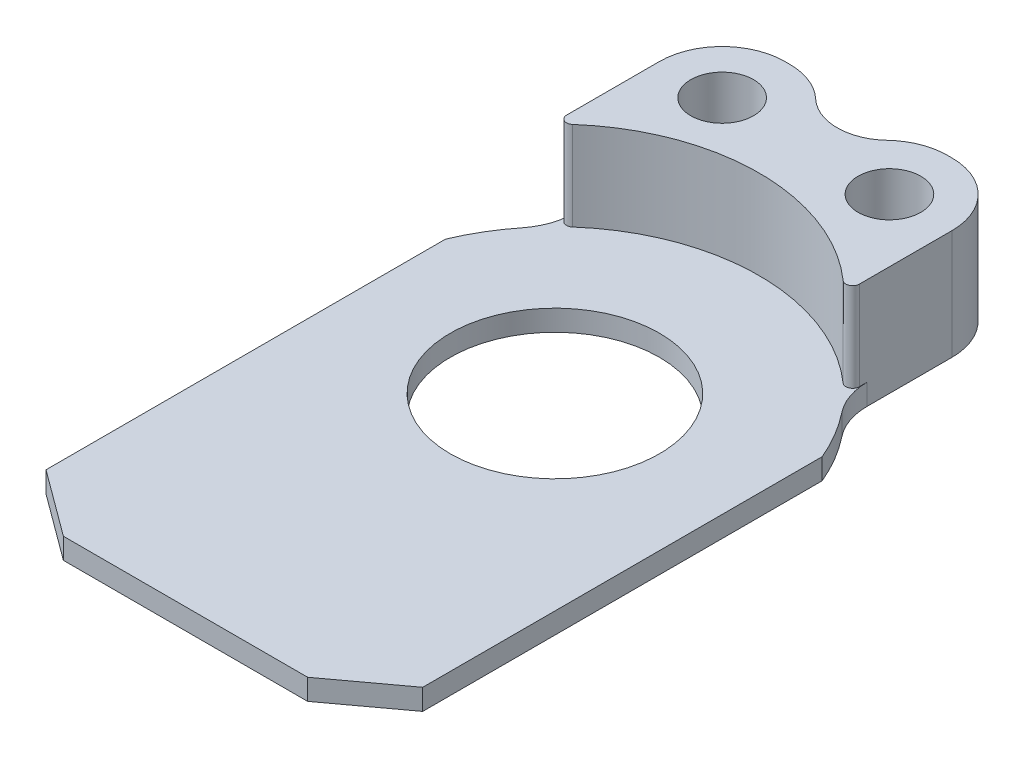
ISO-10303-21;
HEADER;
FILE_DESCRIPTION(('STEP AP214'),'2;1');
FILE_NAME('part.step','',(''),(''),'','','');
FILE_SCHEMA(('AUTOMOTIVE_DESIGN { 1 0 10303 214 1 1 1 1 }'));
ENDSEC;
DATA;
#1=APPLICATION_CONTEXT('core data for automotive mechanical design processes');
#2=APPLICATION_PROTOCOL_DEFINITION('international standard','automotive_design',2000,#1);
#3=PRODUCT_CONTEXT('',#1,'mechanical');
#4=PRODUCT('Part','Part','',(#3));
#5=PRODUCT_RELATED_PRODUCT_CATEGORY('part','',(#4));
#6=PRODUCT_DEFINITION_FORMATION('','',#4);
#7=PRODUCT_DEFINITION_CONTEXT('part definition',#1,'design');
#8=PRODUCT_DEFINITION('design','',#6,#7);
#9=PRODUCT_DEFINITION_SHAPE('','',#8);
#10=(LENGTH_UNIT() NAMED_UNIT(*) SI_UNIT(.MILLI.,.METRE.));
#11=(NAMED_UNIT(*) PLANE_ANGLE_UNIT() SI_UNIT($,.RADIAN.));
#12=(NAMED_UNIT(*) SI_UNIT($,.STERADIAN.) SOLID_ANGLE_UNIT());
#13=UNCERTAINTY_MEASURE_WITH_UNIT(LENGTH_MEASURE(1.E-05),#10,'distance_accuracy_value','');
#14=(GEOMETRIC_REPRESENTATION_CONTEXT(3) GLOBAL_UNCERTAINTY_ASSIGNED_CONTEXT((#13)) GLOBAL_UNIT_ASSIGNED_CONTEXT((#10,
#11,#12)) REPRESENTATION_CONTEXT('',''));
#15=CARTESIAN_POINT('',(0.,0.,0.));
#16=DIRECTION('',(0.,0.,1.));
#17=DIRECTION('',(1.,0.,0.));
#18=AXIS2_PLACEMENT_3D('',#15,#16,#17);
#19=CARTESIAN_POINT('',(0.,8.334375,0.));
#20=DIRECTION('',(0.,-1.,0.));
#21=DIRECTION('',(0.,0.,-1.));
#22=AXIS2_PLACEMENT_3D('',#19,#20,#21);
#23=CYLINDRICAL_SURFACE('',#22,15.505758652836);
#24=DIRECTION('',(0.,1.,0.));
#25=VECTOR('',#24,1.);
#26=CARTESIAN_POINT('',(-10.2680964037683,1.5875,-11.6187240109626));
#27=LINE('',#26,#25);
#28=CARTESIAN_POINT('',(-10.2680964037683,1.5875,-11.6187240109626));
#29=VERTEX_POINT('',#28);
#30=CARTESIAN_POINT('',(-10.2680964037683,8.334375,-11.6187240109626));
#31=VERTEX_POINT('',#30);
#32=EDGE_CURVE('E56',#29,#31,#27,.T.);
#33=ORIENTED_EDGE('',*,*,#32,.F.);
#34=CARTESIAN_POINT('',(0.,1.5875,0.));
#35=DIRECTION('',(0.,1.,0.));
#36=DIRECTION('',(0.,0.,-1.));
#37=AXIS2_PLACEMENT_3D('',#34,#35,#36);
#38=CIRCLE('',#37,15.505758652836);
#39=CARTESIAN_POINT('',(10.2680964037683,1.5875,-11.6187240109626));
#40=VERTEX_POINT('',#39);
#41=EDGE_CURVE('E338',#40,#29,#38,.T.);
#42=ORIENTED_EDGE('',*,*,#41,.F.);
#43=DIRECTION('',(0.,1.,0.));
#44=VECTOR('',#43,1.);
#45=CARTESIAN_POINT('',(10.2680964037683,1.5875,-11.6187240109626));
#46=LINE('',#45,#44);
#47=CARTESIAN_POINT('',(10.2680964037683,8.334375,-11.6187240109626));
#48=VERTEX_POINT('',#47);
#49=EDGE_CURVE('E214',#40,#48,#46,.T.);
#50=ORIENTED_EDGE('',*,*,#49,.T.);
#51=CARTESIAN_POINT('',(0.,8.334375,0.));
#52=DIRECTION('',(0.,-1.,0.));
#53=DIRECTION('',(0.,0.,-1.));
#54=AXIS2_PLACEMENT_3D('',#51,#52,#53);
#55=CIRCLE('',#54,15.505758652836);
#56=EDGE_CURVE('E257',#31,#48,#55,.T.);
#57=ORIENTED_EDGE('',*,*,#56,.F.);
#58=EDGE_LOOP('',(#33,#42,#50,#57));
#59=FACE_BOUND('',#58,.T.);
#60=ADVANCED_FACE('F41',(#59),#23,.F.);
#61=CARTESIAN_POINT('',(0.,1.5875,0.));
#62=DIRECTION('',(0.,-1.,0.));
#63=DIRECTION('',(0.,0.,-1.));
#64=AXIS2_PLACEMENT_3D('',#61,#62,#63);
#65=CYLINDRICAL_SURFACE('',#64,15.505758652836);
#66=DIRECTION('',(0.,-1.,0.));
#67=VECTOR('',#66,1.);
#68=CARTESIAN_POINT('',(12.1447985655802,0.79375,-9.6401462230342));
#69=LINE('',#68,#67);
#70=CARTESIAN_POINT('',(12.1447985655802,1.5875,-9.6401462230342));
#71=VERTEX_POINT('',#70);
#72=CARTESIAN_POINT('',(12.1447985655802,0.,-9.6401462230342));
#73=VERTEX_POINT('',#72);
#74=EDGE_CURVE('E49',#71,#73,#69,.T.);
#75=ORIENTED_EDGE('',*,*,#74,.F.);
#76=CARTESIAN_POINT('',(14.3002,1.5875,-5.9944));
#77=VERTEX_POINT('',#76);
#78=EDGE_CURVE('E335',#77,#71,#38,.T.);
#79=ORIENTED_EDGE('',*,*,#78,.F.);
#80=DIRECTION('',(0.,-1.,0.));
#81=VECTOR('',#80,1.);
#82=CARTESIAN_POINT('',(14.3002,1.5875,-5.9944));
#83=LINE('',#82,#81);
#84=CARTESIAN_POINT('',(14.3002,0.,-5.9944));
#85=VERTEX_POINT('',#84);
#86=EDGE_CURVE('E349',#77,#85,#83,.T.);
#87=ORIENTED_EDGE('',*,*,#86,.T.);
#88=CARTESIAN_POINT('',(0.,0.,0.));
#89=DIRECTION('',(0.,1.,0.));
#90=DIRECTION('',(0.,0.,-1.));
#91=AXIS2_PLACEMENT_3D('',#88,#89,#90);
#92=CIRCLE('',#91,15.505758652836);
#93=EDGE_CURVE('E64',#85,#73,#92,.T.);
#94=ORIENTED_EDGE('',*,*,#93,.T.);
#95=EDGE_LOOP('',(#75,#79,#87,#94));
#96=FACE_BOUND('',#95,.T.);
#97=ADVANCED_FACE('F422',(#96),#65,.T.);
#98=CARTESIAN_POINT('',(0.,1.5875,0.));
#99=DIRECTION('',(0.,-1.,0.));
#100=DIRECTION('',(0.,0.,-1.));
#101=AXIS2_PLACEMENT_3D('',#98,#99,#100);
#102=PLANE('',#101);
#103=CARTESIAN_POINT('',(0.,1.5875,0.));
#104=DIRECTION('',(0.,1.,0.));
#105=DIRECTION('',(0.,0.,1.));
#106=AXIS2_PLACEMENT_3D('',#103,#104,#105);
#107=CIRCLE('',#106,7.93750000000004);
#108=CARTESIAN_POINT('',(0.,1.5875,7.93750000000004));
#109=VERTEX_POINT('',#108);
#110=EDGE_CURVE('E329',#109,#109,#107,.T.);
#111=ORIENTED_EDGE('',*,*,#110,.F.);
#112=EDGE_LOOP('',(#111));
#113=FACE_BOUND('',#112,.T.);
#114=ORIENTED_EDGE('',*,*,#78,.T.);
#115=CARTESIAN_POINT('',(15.875,1.5875,-12.6010588371876));
#116=DIRECTION('',(0.,-1.,0.));
#117=DIRECTION('',(0.,0.,-1.));
#118=AXIS2_PLACEMENT_3D('',#115,#116,#117);
#119=CIRCLE('',#118,4.7625);
#120=CARTESIAN_POINT('',(11.1125,1.5875,-12.6010588371876));
#121=VERTEX_POINT('',#120);
#122=EDGE_CURVE('E201',#121,#71,#119,.F.);
#123=ORIENTED_EDGE('',*,*,#122,.F.);
#124=DIRECTION('',(0.,0.,1.));
#125=VECTOR('',#124,1.);
#126=CARTESIAN_POINT('',(11.1125,1.5875,-19.05));
#127=LINE('',#126,#125);
#128=CARTESIAN_POINT('',(11.1125,1.5875,-11.9993768980427));
#129=VERTEX_POINT('',#128);
#130=EDGE_CURVE('E193',#121,#129,#127,.T.);
#131=ORIENTED_EDGE('',*,*,#130,.T.);
#132=CARTESIAN_POINT('',(10.6045,1.5875,-11.9993768980427));
#133=DIRECTION('',(0.,-1.,0.));
#134=DIRECTION('',(0.,0.,-1.));
#135=AXIS2_PLACEMENT_3D('',#132,#133,#134);
#136=CIRCLE('',#135,0.507999999999999);
#137=EDGE_CURVE('E198',#129,#40,#136,.T.);
#138=ORIENTED_EDGE('',*,*,#137,.T.);
#139=ORIENTED_EDGE('',*,*,#41,.T.);
#140=CARTESIAN_POINT('',(-10.6045,1.5875,-11.9993768980427));
#141=DIRECTION('',(0.,-1.,0.));
#142=DIRECTION('',(0.,0.,1.));
#143=AXIS2_PLACEMENT_3D('',#140,#141,#142);
#144=CIRCLE('',#143,0.507999999999998);
#145=CARTESIAN_POINT('',(-11.1125,1.5875,-11.9993768980427));
#146=VERTEX_POINT('',#145);
#147=EDGE_CURVE('E219',#29,#146,#144,.T.);
#148=ORIENTED_EDGE('',*,*,#147,.T.);
#149=DIRECTION('',(0.,0.,-1.));
#150=VECTOR('',#149,1.);
#151=CARTESIAN_POINT('',(-11.1125,1.5875,-19.05));
#152=LINE('',#151,#150);
#153=CARTESIAN_POINT('',(-11.1125,1.5875,-12.6010588371876));
#154=VERTEX_POINT('',#153);
#155=EDGE_CURVE('E215',#146,#154,#152,.T.);
#156=ORIENTED_EDGE('',*,*,#155,.T.);
#157=CARTESIAN_POINT('',(-15.875,1.5875,-12.6010588371876));
#158=DIRECTION('',(0.,-1.,0.));
#159=DIRECTION('',(0.,0.,-1.));
#160=AXIS2_PLACEMENT_3D('',#157,#158,#159);
#161=CIRCLE('',#160,4.7625);
#162=CARTESIAN_POINT('',(-12.1447985655802,1.5875,-9.6401462230342));
#163=VERTEX_POINT('',#162);
#164=EDGE_CURVE('E234',#163,#154,#161,.F.);
#165=ORIENTED_EDGE('',*,*,#164,.F.);
#166=CARTESIAN_POINT('',(-14.3002,1.5875,-5.9944));
#167=VERTEX_POINT('',#166);
#168=EDGE_CURVE('E339',#163,#167,#38,.T.);
#169=ORIENTED_EDGE('',*,*,#168,.T.);
#170=DIRECTION('',(0.,0.,1.));
#171=VECTOR('',#170,1.);
#172=CARTESIAN_POINT('',(-14.3002,1.5875,-5.9944));
#173=LINE('',#172,#171);
#174=CARTESIAN_POINT('',(-14.3002,1.5875,24.3332));
#175=VERTEX_POINT('',#174);
#176=EDGE_CURVE('E337',#167,#175,#173,.T.);
#177=ORIENTED_EDGE('',*,*,#176,.T.);
#178=DIRECTION('',(0.804851449595141,0.,0.59347632141864));
#179=VECTOR('',#178,1.);
#180=CARTESIAN_POINT('',(-14.3002,1.5875,24.3332));
#181=LINE('',#180,#179);
#182=CARTESIAN_POINT('',(-9.271,1.5875,28.0416));
#183=VERTEX_POINT('',#182);
#184=EDGE_CURVE('E341',#175,#183,#181,.T.);
#185=ORIENTED_EDGE('',*,*,#184,.T.);
#186=DIRECTION('',(1.,0.,0.));
#187=VECTOR('',#186,1.);
#188=CARTESIAN_POINT('',(-9.271,1.5875,28.0416));
#189=LINE('',#188,#187);
#190=CARTESIAN_POINT('',(9.271,1.5875,28.0416));
#191=VERTEX_POINT('',#190);
#192=EDGE_CURVE('E343',#183,#191,#189,.T.);
#193=ORIENTED_EDGE('',*,*,#192,.T.);
#194=DIRECTION('',(0.804851449595141,0.,-0.593476321418639));
#195=VECTOR('',#194,1.);
#196=CARTESIAN_POINT('',(9.271,1.5875,28.0416));
#197=LINE('',#196,#195);
#198=CARTESIAN_POINT('',(14.3002,1.5875,24.3332));
#199=VERTEX_POINT('',#198);
#200=EDGE_CURVE('E345',#191,#199,#197,.T.);
#201=ORIENTED_EDGE('',*,*,#200,.T.);
#202=DIRECTION('',(0.,0.,-1.));
#203=VECTOR('',#202,1.);
#204=CARTESIAN_POINT('',(14.3002,1.5875,24.3332));
#205=LINE('',#204,#203);
#206=EDGE_CURVE('E347',#199,#77,#205,.T.);
#207=ORIENTED_EDGE('',*,*,#206,.T.);
#208=EDGE_LOOP('',(#114,#123,#131,#138,#139,#148,#156,#165,#169,#177,#185,#193,#201,#207));
#209=FACE_BOUND('',#208,.T.);
#210=ADVANCED_FACE('F195',(#113,#209),#102,.F.);
#211=CARTESIAN_POINT('',(0.,0.,0.));
#212=DIRECTION('',(0.,-1.,0.));
#213=DIRECTION('',(0.,0.,-1.));
#214=AXIS2_PLACEMENT_3D('',#211,#212,#213);
#215=PLANE('',#214);
#216=ORIENTED_EDGE('',*,*,#93,.F.);
#217=DIRECTION('',(0.,0.,-1.));
#218=VECTOR('',#217,1.);
#219=CARTESIAN_POINT('',(14.3002,0.,24.3332));
#220=LINE('',#219,#218);
#221=CARTESIAN_POINT('',(14.3002,0.,24.3332));
#222=VERTEX_POINT('',#221);
#223=EDGE_CURVE('E359',#222,#85,#220,.T.);
#224=ORIENTED_EDGE('',*,*,#223,.F.);
#225=DIRECTION('',(0.804851449595141,0.,-0.593476321418639));
#226=VECTOR('',#225,1.);
#227=CARTESIAN_POINT('',(9.271,0.,28.0416));
#228=LINE('',#227,#226);
#229=CARTESIAN_POINT('',(9.271,0.,28.0416));
#230=VERTEX_POINT('',#229);
#231=EDGE_CURVE('E357',#230,#222,#228,.T.);
#232=ORIENTED_EDGE('',*,*,#231,.F.);
#233=DIRECTION('',(1.,0.,0.));
#234=VECTOR('',#233,1.);
#235=CARTESIAN_POINT('',(-9.271,0.,28.0416));
#236=LINE('',#235,#234);
#237=CARTESIAN_POINT('',(-9.271,0.,28.0416));
#238=VERTEX_POINT('',#237);
#239=EDGE_CURVE('E355',#238,#230,#236,.T.);
#240=ORIENTED_EDGE('',*,*,#239,.F.);
#241=DIRECTION('',(0.804851449595141,0.,0.59347632141864));
#242=VECTOR('',#241,1.);
#243=CARTESIAN_POINT('',(-14.3002,0.,24.3332));
#244=LINE('',#243,#242);
#245=CARTESIAN_POINT('',(-14.3002,0.,24.3332));
#246=VERTEX_POINT('',#245);
#247=EDGE_CURVE('E353',#246,#238,#244,.T.);
#248=ORIENTED_EDGE('',*,*,#247,.F.);
#249=DIRECTION('',(0.,0.,1.));
#250=VECTOR('',#249,1.);
#251=CARTESIAN_POINT('',(-14.3002,0.,-5.9944));
#252=LINE('',#251,#250);
#253=CARTESIAN_POINT('',(-14.3002,0.,-5.9944));
#254=VERTEX_POINT('',#253);
#255=EDGE_CURVE('E351',#254,#246,#252,.T.);
#256=ORIENTED_EDGE('',*,*,#255,.F.);
#257=CARTESIAN_POINT('',(-12.1447985655802,0.,-9.6401462230342));
#258=VERTEX_POINT('',#257);
#259=EDGE_CURVE('E332',#258,#254,#92,.T.);
#260=ORIENTED_EDGE('',*,*,#259,.F.);
#261=CARTESIAN_POINT('',(-15.875,0.,-12.6010588371876));
#262=DIRECTION('',(0.,-1.,0.));
#263=DIRECTION('',(0.,0.,-1.));
#264=AXIS2_PLACEMENT_3D('',#261,#262,#263);
#265=CIRCLE('',#264,4.7625);
#266=CARTESIAN_POINT('',(-11.1125,0.,-12.6010588371876));
#267=VERTEX_POINT('',#266);
#268=EDGE_CURVE('E294',#267,#258,#265,.T.);
#269=ORIENTED_EDGE('',*,*,#268,.F.);
#270=DIRECTION('',(0.,0.,1.));
#271=VECTOR('',#270,1.);
#272=CARTESIAN_POINT('',(-11.1125,0.,0.));
#273=LINE('',#272,#271);
#274=CARTESIAN_POINT('',(-11.1125,0.,-19.05));
#275=VERTEX_POINT('',#274);
#276=EDGE_CURVE('E297',#275,#267,#273,.T.);
#277=ORIENTED_EDGE('',*,*,#276,.F.);
#278=CARTESIAN_POINT('',(-6.35,0.,-19.05));
#279=DIRECTION('',(0.,-1.,0.));
#280=DIRECTION('',(0.,0.,-1.));
#281=AXIS2_PLACEMENT_3D('',#278,#279,#280);
#282=CIRCLE('',#281,4.7625);
#283=CARTESIAN_POINT('',(-6.34999999999996,0.,-23.8125));
#284=VERTEX_POINT('',#283);
#285=EDGE_CURVE('E300',#284,#275,#282,.F.);
#286=ORIENTED_EDGE('',*,*,#285,.F.);
#287=DIRECTION('',(1.,0.,0.));
#288=VECTOR('',#287,1.);
#289=CARTESIAN_POINT('',(0.,0.,-23.8125));
#290=LINE('',#289,#288);
#291=CARTESIAN_POINT('',(-5.98342544116662,0.,-23.8125));
#292=VERTEX_POINT('',#291);
#293=EDGE_CURVE('E303',#284,#292,#290,.T.);
#294=ORIENTED_EDGE('',*,*,#293,.T.);
#295=CARTESIAN_POINT('',(-5.98342544116662,0.,-19.05));
#296=DIRECTION('',(0.,-1.,0.));
#297=DIRECTION('',(0.,0.,-1.));
#298=AXIS2_PLACEMENT_3D('',#295,#296,#297);
#299=CIRCLE('',#298,4.7625);
#300=CARTESIAN_POINT('',(-2.71736351913244,0.,-22.5161572052402));
#301=VERTEX_POINT('',#300);
#302=EDGE_CURVE('E242',#301,#292,#299,.F.);
#303=ORIENTED_EDGE('',*,*,#302,.F.);
#304=CARTESIAN_POINT('',(0.,0.,-25.4));
#305=DIRECTION('',(0.,-1.,0.));
#306=DIRECTION('',(0.,0.,-1.));
#307=AXIS2_PLACEMENT_3D('',#304,#305,#306);
#308=CIRCLE('',#307,3.9624);
#309=CARTESIAN_POINT('',(2.71736351913244,0.,-22.5161572052402));
#310=VERTEX_POINT('',#309);
#311=EDGE_CURVE('E276',#301,#310,#308,.F.);
#312=ORIENTED_EDGE('',*,*,#311,.T.);
#313=CARTESIAN_POINT('',(5.98342544116662,0.,-19.05));
#314=DIRECTION('',(0.,-1.,0.));
#315=DIRECTION('',(0.,0.,-1.));
#316=AXIS2_PLACEMENT_3D('',#313,#314,#315);
#317=CIRCLE('',#316,4.7625);
#318=CARTESIAN_POINT('',(5.98342544116662,0.,-23.8125));
#319=VERTEX_POINT('',#318);
#320=EDGE_CURVE('E279',#310,#319,#317,.T.);
#321=ORIENTED_EDGE('',*,*,#320,.T.);
#322=DIRECTION('',(-1.,0.,0.));
#323=VECTOR('',#322,1.);
#324=CARTESIAN_POINT('',(0.,0.,-23.8125));
#325=LINE('',#324,#323);
#326=CARTESIAN_POINT('',(6.34999999999997,0.,-23.8125));
#327=VERTEX_POINT('',#326);
#328=EDGE_CURVE('E282',#327,#319,#325,.T.);
#329=ORIENTED_EDGE('',*,*,#328,.F.);
#330=CARTESIAN_POINT('',(6.35,0.,-19.05));
#331=DIRECTION('',(0.,-1.,0.));
#332=DIRECTION('',(0.,0.,-1.));
#333=AXIS2_PLACEMENT_3D('',#330,#331,#332);
#334=CIRCLE('',#333,4.7625);
#335=CARTESIAN_POINT('',(11.1125,0.,-19.05));
#336=VERTEX_POINT('',#335);
#337=EDGE_CURVE('E285',#336,#327,#334,.F.);
#338=ORIENTED_EDGE('',*,*,#337,.F.);
#339=DIRECTION('',(0.,0.,1.));
#340=VECTOR('',#339,1.);
#341=CARTESIAN_POINT('',(11.1125,0.,0.));
#342=LINE('',#341,#340);
#343=CARTESIAN_POINT('',(11.1125,0.,-12.6010588371876));
#344=VERTEX_POINT('',#343);
#345=EDGE_CURVE('E288',#336,#344,#342,.T.);
#346=ORIENTED_EDGE('',*,*,#345,.T.);
#347=CARTESIAN_POINT('',(15.875,0.,-12.6010588371876));
#348=DIRECTION('',(0.,-1.,0.));
#349=DIRECTION('',(0.,0.,-1.));
#350=AXIS2_PLACEMENT_3D('',#347,#348,#349);
#351=CIRCLE('',#350,4.7625);
#352=EDGE_CURVE('E291',#73,#344,#351,.T.);
#353=ORIENTED_EDGE('',*,*,#352,.F.);
#354=EDGE_LOOP('',(#216,#224,#232,#240,#248,#256,#260,#269,#277,#286,#294,#303,#312,#321,#329,
#338,#346,#353));
#355=FACE_BOUND('',#354,.T.);
#356=CARTESIAN_POINT('',(0.,0.,0.));
#357=DIRECTION('',(0.,1.,0.));
#358=DIRECTION('',(0.,0.,1.));
#359=AXIS2_PLACEMENT_3D('',#356,#357,#358);
#360=CIRCLE('',#359,7.93750000000004);
#361=CARTESIAN_POINT('',(0.,0.,7.93750000000004));
#362=VERTEX_POINT('',#361);
#363=EDGE_CURVE('E310',#362,#362,#360,.T.);
#364=ORIENTED_EDGE('',*,*,#363,.T.);
#365=EDGE_LOOP('',(#364));
#366=FACE_BOUND('',#365,.T.);
#367=CARTESIAN_POINT('',(-6.35,0.,-19.05));
#368=DIRECTION('',(0.,-1.,0.));
#369=DIRECTION('',(0.,0.,-1.));
#370=AXIS2_PLACEMENT_3D('',#367,#368,#369);
#371=CIRCLE('',#370,2.38125);
#372=CARTESIAN_POINT('',(-6.35,0.,-21.43125));
#373=VERTEX_POINT('',#372);
#374=EDGE_CURVE('E237',#373,#373,#371,.T.);
#375=ORIENTED_EDGE('',*,*,#374,.F.);
#376=EDGE_LOOP('',(#375));
#377=FACE_BOUND('',#376,.T.);
#378=CARTESIAN_POINT('',(6.35,0.,-19.05));
#379=DIRECTION('',(0.,-1.,0.));
#380=DIRECTION('',(0.,0.,-1.));
#381=AXIS2_PLACEMENT_3D('',#378,#379,#380);
#382=CIRCLE('',#381,2.38125);
#383=CARTESIAN_POINT('',(6.35,0.,-21.43125));
#384=VERTEX_POINT('',#383);
#385=EDGE_CURVE('E273',#384,#384,#382,.T.);
#386=ORIENTED_EDGE('',*,*,#385,.F.);
#387=EDGE_LOOP('',(#386));
#388=FACE_BOUND('',#387,.T.);
#389=ADVANCED_FACE('F381',(#355,#366,#377,#388),#215,.T.);
#390=ORIENTED_EDGE('',*,*,#168,.F.);
#391=DIRECTION('',(0.,-1.,0.));
#392=VECTOR('',#391,1.);
#393=CARTESIAN_POINT('',(-12.1447985655802,0.793750000000001,-9.6401462230342));
#394=LINE('',#393,#392);
#395=EDGE_CURVE('E11',#163,#258,#394,.T.);
#396=ORIENTED_EDGE('',*,*,#395,.T.);
#397=ORIENTED_EDGE('',*,*,#259,.T.);
#398=DIRECTION('',(0.,-1.,0.));
#399=VECTOR('',#398,1.);
#400=CARTESIAN_POINT('',(-14.3002,1.5875,-5.9944));
#401=LINE('',#400,#399);
#402=EDGE_CURVE('E374',#167,#254,#401,.T.);
#403=ORIENTED_EDGE('',*,*,#402,.F.);
#404=EDGE_LOOP('',(#390,#396,#397,#403));
#405=FACE_BOUND('',#404,.T.);
#406=ADVANCED_FACE('F43',(#405),#65,.T.);
#407=CARTESIAN_POINT('',(-14.3002,1.5875,-5.9944));
#408=DIRECTION('',(1.,0.,0.));
#409=DIRECTION('',(0.,0.,-1.));
#410=AXIS2_PLACEMENT_3D('',#407,#408,#409);
#411=PLANE('',#410);
#412=ORIENTED_EDGE('',*,*,#255,.T.);
#413=DIRECTION('',(0.,-1.,0.));
#414=VECTOR('',#413,1.);
#415=CARTESIAN_POINT('',(-14.3002,1.5875,24.3332));
#416=LINE('',#415,#414);
#417=EDGE_CURVE('E371',#175,#246,#416,.T.);
#418=ORIENTED_EDGE('',*,*,#417,.F.);
#419=ORIENTED_EDGE('',*,*,#176,.F.);
#420=ORIENTED_EDGE('',*,*,#402,.T.);
#421=EDGE_LOOP('',(#412,#418,#419,#420));
#422=FACE_BOUND('',#421,.T.);
#423=ADVANCED_FACE('F400',(#422),#411,.F.);
#424=CARTESIAN_POINT('',(-14.3002,1.5875,24.3332));
#425=DIRECTION('',(0.59347632141864,0.,-0.804851449595141));
#426=DIRECTION('',(-0.804851449595141,0.,-0.59347632141864));
#427=AXIS2_PLACEMENT_3D('',#424,#425,#426);
#428=PLANE('',#427);
#429=ORIENTED_EDGE('',*,*,#247,.T.);
#430=DIRECTION('',(0.,-1.,0.));
#431=VECTOR('',#430,1.);
#432=CARTESIAN_POINT('',(-9.271,1.5875,28.0416));
#433=LINE('',#432,#431);
#434=EDGE_CURVE('E368',#183,#238,#433,.T.);
#435=ORIENTED_EDGE('',*,*,#434,.F.);
#436=ORIENTED_EDGE('',*,*,#184,.F.);
#437=ORIENTED_EDGE('',*,*,#417,.T.);
#438=EDGE_LOOP('',(#429,#435,#436,#437));
#439=FACE_BOUND('',#438,.T.);
#440=ADVANCED_FACE('F407',(#439),#428,.F.);
#441=CARTESIAN_POINT('',(-9.271,1.5875,28.0416));
#442=DIRECTION('',(0.,0.,-1.));
#443=DIRECTION('',(-1.,0.,0.));
#444=AXIS2_PLACEMENT_3D('',#441,#442,#443);
#445=PLANE('',#444);
#446=ORIENTED_EDGE('',*,*,#239,.T.);
#447=DIRECTION('',(0.,-1.,0.));
#448=VECTOR('',#447,1.);
#449=CARTESIAN_POINT('',(9.271,1.5875,28.0416));
#450=LINE('',#449,#448);
#451=EDGE_CURVE('E365',#191,#230,#450,.T.);
#452=ORIENTED_EDGE('',*,*,#451,.F.);
#453=ORIENTED_EDGE('',*,*,#192,.F.);
#454=ORIENTED_EDGE('',*,*,#434,.T.);
#455=EDGE_LOOP('',(#446,#452,#453,#454));
#456=FACE_BOUND('',#455,.T.);
#457=ADVANCED_FACE('F414',(#456),#445,.F.);
#458=CARTESIAN_POINT('',(9.271,1.5875,28.0416));
#459=DIRECTION('',(-0.593476321418639,0.,-0.804851449595141));
#460=DIRECTION('',(-0.804851449595141,0.,0.593476321418639));
#461=AXIS2_PLACEMENT_3D('',#458,#459,#460);
#462=PLANE('',#461);
#463=ORIENTED_EDGE('',*,*,#231,.T.);
#464=DIRECTION('',(0.,-1.,0.));
#465=VECTOR('',#464,1.);
#466=CARTESIAN_POINT('',(14.3002,1.5875,24.3332));
#467=LINE('',#466,#465);
#468=EDGE_CURVE('E362',#199,#222,#467,.T.);
#469=ORIENTED_EDGE('',*,*,#468,.F.);
#470=ORIENTED_EDGE('',*,*,#200,.F.);
#471=ORIENTED_EDGE('',*,*,#451,.T.);
#472=EDGE_LOOP('',(#463,#469,#470,#471));
#473=FACE_BOUND('',#472,.T.);
#474=ADVANCED_FACE('F417',(#473),#462,.F.);
#475=CARTESIAN_POINT('',(14.3002,1.5875,24.3332));
#476=DIRECTION('',(-1.,0.,0.));
#477=DIRECTION('',(0.,0.,1.));
#478=AXIS2_PLACEMENT_3D('',#475,#476,#477);
#479=PLANE('',#478);
#480=ORIENTED_EDGE('',*,*,#223,.T.);
#481=ORIENTED_EDGE('',*,*,#86,.F.);
#482=ORIENTED_EDGE('',*,*,#206,.F.);
#483=ORIENTED_EDGE('',*,*,#468,.T.);
#484=EDGE_LOOP('',(#480,#481,#482,#483));
#485=FACE_BOUND('',#484,.T.);
#486=ADVANCED_FACE('F421',(#485),#479,.F.);
#487=CARTESIAN_POINT('',(0.,1.5875,0.));
#488=DIRECTION('',(0.,-1.,0.));
#489=DIRECTION('',(0.,0.,-1.));
#490=AXIS2_PLACEMENT_3D('',#487,#488,#489);
#491=CYLINDRICAL_SURFACE('',#490,7.93750000000004);
#492=ORIENTED_EDGE('',*,*,#110,.T.);
#493=EDGE_LOOP('',(#492));
#494=FACE_BOUND('',#493,.T.);
#495=ORIENTED_EDGE('',*,*,#363,.F.);
#496=EDGE_LOOP('',(#495));
#497=FACE_BOUND('',#496,.T.);
#498=ADVANCED_FACE('F443',(#494,#497),#491,.F.);
#499=CARTESIAN_POINT('',(0.,8.334375,-25.4));
#500=DIRECTION('',(0.,-1.,0.));
#501=DIRECTION('',(0.,0.,-1.));
#502=AXIS2_PLACEMENT_3D('',#499,#500,#501);
#503=CYLINDRICAL_SURFACE('',#502,3.9624);
#504=ORIENTED_EDGE('',*,*,#311,.F.);
#505=DIRECTION('',(0.,-1.,0.));
#506=VECTOR('',#505,1.);
#507=CARTESIAN_POINT('',(-2.71736351913244,8.334375,-22.5161572052402));
#508=LINE('',#507,#506);
#509=CARTESIAN_POINT('',(-2.71736351913244,8.334375,-22.5161572052402));
#510=VERTEX_POINT('',#509);
#511=EDGE_CURVE('E308',#510,#301,#508,.T.);
#512=ORIENTED_EDGE('',*,*,#511,.F.);
#513=CARTESIAN_POINT('',(0.,8.334375,-25.4));
#514=DIRECTION('',(0.,-1.,0.));
#515=DIRECTION('',(0.,0.,-1.));
#516=AXIS2_PLACEMENT_3D('',#513,#514,#515);
#517=CIRCLE('',#516,3.9624);
#518=CARTESIAN_POINT('',(2.71736351913244,8.334375,-22.5161572052402));
#519=VERTEX_POINT('',#518);
#520=EDGE_CURVE('E245',#510,#519,#517,.F.);
#521=ORIENTED_EDGE('',*,*,#520,.T.);
#522=DIRECTION('',(0.,-1.,0.));
#523=VECTOR('',#522,1.);
#524=CARTESIAN_POINT('',(2.71736351913244,8.334375,-22.5161572052402));
#525=LINE('',#524,#523);
#526=EDGE_CURVE('E270',#519,#310,#525,.T.);
#527=ORIENTED_EDGE('',*,*,#526,.T.);
#528=EDGE_LOOP('',(#504,#512,#521,#527));
#529=FACE_BOUND('',#528,.T.);
#530=ADVANCED_FACE('F471',(#529),#503,.F.);
#531=CARTESIAN_POINT('',(-5.98342544116662,8.334375,-19.05));
#532=DIRECTION('',(0.,-1.,0.));
#533=DIRECTION('',(0.,0.,-1.));
#534=AXIS2_PLACEMENT_3D('',#531,#532,#533);
#535=CYLINDRICAL_SURFACE('',#534,4.7625);
#536=ORIENTED_EDGE('',*,*,#302,.T.);
#537=DIRECTION('',(0.,-1.,0.));
#538=VECTOR('',#537,1.);
#539=CARTESIAN_POINT('',(-5.98342544116662,8.334375,-23.8125));
#540=LINE('',#539,#538);
#541=CARTESIAN_POINT('',(-5.98342544116662,8.334375,-23.8125));
#542=VERTEX_POINT('',#541);
#543=EDGE_CURVE('E311',#542,#292,#540,.T.);
#544=ORIENTED_EDGE('',*,*,#543,.F.);
#545=CARTESIAN_POINT('',(-5.98342544116662,8.334375,-19.05));
#546=DIRECTION('',(0.,-1.,0.));
#547=DIRECTION('',(0.,0.,-1.));
#548=AXIS2_PLACEMENT_3D('',#545,#546,#547);
#549=CIRCLE('',#548,4.7625);
#550=EDGE_CURVE('E268',#510,#542,#549,.F.);
#551=ORIENTED_EDGE('',*,*,#550,.F.);
#552=ORIENTED_EDGE('',*,*,#511,.T.);
#553=EDGE_LOOP('',(#536,#544,#551,#552));
#554=FACE_BOUND('',#553,.T.);
#555=ADVANCED_FACE('F479',(#554),#535,.T.);
#556=CARTESIAN_POINT('',(0.,8.334375,-23.8125));
#557=DIRECTION('',(0.,0.,-1.));
#558=DIRECTION('',(-1.,0.,0.));
#559=AXIS2_PLACEMENT_3D('',#556,#557,#558);
#560=PLANE('',#559);
#561=ORIENTED_EDGE('',*,*,#293,.F.);
#562=DIRECTION('',(0.,-1.,0.));
#563=VECTOR('',#562,1.);
#564=CARTESIAN_POINT('',(-6.34999999999996,8.334375,-23.8125));
#565=LINE('',#564,#563);
#566=CARTESIAN_POINT('',(-6.34999999999996,8.334375,-23.8125));
#567=VERTEX_POINT('',#566);
#568=EDGE_CURVE('E313',#567,#284,#565,.T.);
#569=ORIENTED_EDGE('',*,*,#568,.F.);
#570=DIRECTION('',(1.,0.,0.));
#571=VECTOR('',#570,1.);
#572=CARTESIAN_POINT('',(0.,8.334375,-23.8125));
#573=LINE('',#572,#571);
#574=EDGE_CURVE('E265',#567,#542,#573,.T.);
#575=ORIENTED_EDGE('',*,*,#574,.T.);
#576=ORIENTED_EDGE('',*,*,#543,.T.);
#577=EDGE_LOOP('',(#561,#569,#575,#576));
#578=FACE_BOUND('',#577,.T.);
#579=ADVANCED_FACE('F487',(#578),#560,.T.);
#580=CARTESIAN_POINT('',(-6.35,8.334375,-19.05));
#581=DIRECTION('',(0.,-1.,0.));
#582=DIRECTION('',(0.,0.,-1.));
#583=AXIS2_PLACEMENT_3D('',#580,#581,#582);
#584=CYLINDRICAL_SURFACE('',#583,4.7625);
#585=ORIENTED_EDGE('',*,*,#285,.T.);
#586=DIRECTION('',(0.,-1.,0.));
#587=VECTOR('',#586,1.);
#588=CARTESIAN_POINT('',(-11.1125,8.334375,-19.05));
#589=LINE('',#588,#587);
#590=CARTESIAN_POINT('',(-11.1125,8.334375,-19.05));
#591=VERTEX_POINT('',#590);
#592=EDGE_CURVE('E315',#591,#275,#589,.T.);
#593=ORIENTED_EDGE('',*,*,#592,.F.);
#594=CARTESIAN_POINT('',(-6.35,8.334375,-19.05));
#595=DIRECTION('',(0.,-1.,0.));
#596=DIRECTION('',(0.,0.,-1.));
#597=AXIS2_PLACEMENT_3D('',#594,#595,#596);
#598=CIRCLE('',#597,4.7625);
#599=EDGE_CURVE('E262',#567,#591,#598,.F.);
#600=ORIENTED_EDGE('',*,*,#599,.F.);
#601=ORIENTED_EDGE('',*,*,#568,.T.);
#602=EDGE_LOOP('',(#585,#593,#600,#601));
#603=FACE_BOUND('',#602,.T.);
#604=ADVANCED_FACE('F495',(#603),#584,.T.);
#605=CARTESIAN_POINT('',(-11.1125,8.334375,0.));
#606=DIRECTION('',(1.,0.,0.));
#607=DIRECTION('',(0.,0.,-1.));
#608=AXIS2_PLACEMENT_3D('',#605,#606,#607);
#609=PLANE('',#608);
#610=DIRECTION('',(0.,-1.,0.));
#611=VECTOR('',#610,1.);
#612=CARTESIAN_POINT('',(-11.1125,8.334375,-12.6010588371876));
#613=LINE('',#612,#611);
#614=EDGE_CURVE('E317',#154,#267,#613,.T.);
#615=ORIENTED_EDGE('',*,*,#614,.F.);
#616=ORIENTED_EDGE('',*,*,#155,.F.);
#617=DIRECTION('',(0.,1.,0.));
#618=VECTOR('',#617,1.);
#619=CARTESIAN_POINT('',(-11.1125,1.5875,-11.9993768980427));
#620=LINE('',#619,#618);
#621=CARTESIAN_POINT('',(-11.1125,8.334375,-11.9993768980427));
#622=VERTEX_POINT('',#621);
#623=EDGE_CURVE('E228',#146,#622,#620,.T.);
#624=ORIENTED_EDGE('',*,*,#623,.T.);
#625=DIRECTION('',(0.,0.,1.));
#626=VECTOR('',#625,1.);
#627=CARTESIAN_POINT('',(-11.1125,8.334375,0.));
#628=LINE('',#627,#626);
#629=EDGE_CURVE('E260',#591,#622,#628,.T.);
#630=ORIENTED_EDGE('',*,*,#629,.F.);
#631=ORIENTED_EDGE('',*,*,#592,.T.);
#632=ORIENTED_EDGE('',*,*,#276,.T.);
#633=EDGE_LOOP('',(#615,#616,#624,#630,#631,#632));
#634=FACE_BOUND('',#633,.T.);
#635=ADVANCED_FACE('F503',(#634),#609,.F.);
#636=CARTESIAN_POINT('',(-15.875,8.334375,-12.6010588371876));
#637=DIRECTION('',(0.,-1.,0.));
#638=DIRECTION('',(0.,0.,-1.));
#639=AXIS2_PLACEMENT_3D('',#636,#637,#638);
#640=CYLINDRICAL_SURFACE('',#639,4.7625);
#641=ORIENTED_EDGE('',*,*,#395,.F.);
#642=ORIENTED_EDGE('',*,*,#164,.T.);
#643=ORIENTED_EDGE('',*,*,#614,.T.);
#644=ORIENTED_EDGE('',*,*,#268,.T.);
#645=EDGE_LOOP('',(#641,#642,#643,#644));
#646=FACE_BOUND('',#645,.T.);
#647=ADVANCED_FACE('F511',(#646),#640,.F.);
#648=CARTESIAN_POINT('',(15.875,8.334375,-12.6010588371876));
#649=DIRECTION('',(0.,-1.,0.));
#650=DIRECTION('',(0.,0.,-1.));
#651=AXIS2_PLACEMENT_3D('',#648,#649,#650);
#652=CYLINDRICAL_SURFACE('',#651,4.7625);
#653=DIRECTION('',(0.,-1.,0.));
#654=VECTOR('',#653,1.);
#655=CARTESIAN_POINT('',(11.1125,8.334375,-12.6010588371876));
#656=LINE('',#655,#654);
#657=EDGE_CURVE('E319',#121,#344,#656,.T.);
#658=ORIENTED_EDGE('',*,*,#657,.F.);
#659=ORIENTED_EDGE('',*,*,#122,.T.);
#660=ORIENTED_EDGE('',*,*,#74,.T.);
#661=ORIENTED_EDGE('',*,*,#352,.T.);
#662=EDGE_LOOP('',(#658,#659,#660,#661));
#663=FACE_BOUND('',#662,.T.);
#664=ADVANCED_FACE('F378',(#663),#652,.F.);
#665=CARTESIAN_POINT('',(11.1125,8.334375,0.));
#666=DIRECTION('',(1.,0.,0.));
#667=DIRECTION('',(0.,0.,-1.));
#668=AXIS2_PLACEMENT_3D('',#665,#666,#667);
#669=PLANE('',#668);
#670=ORIENTED_EDGE('',*,*,#345,.F.);
#671=DIRECTION('',(0.,-1.,0.));
#672=VECTOR('',#671,1.);
#673=CARTESIAN_POINT('',(11.1125,8.334375,-19.05));
#674=LINE('',#673,#672);
#675=CARTESIAN_POINT('',(11.1125,8.334375,-19.05));
#676=VERTEX_POINT('',#675);
#677=EDGE_CURVE('E321',#676,#336,#674,.T.);
#678=ORIENTED_EDGE('',*,*,#677,.F.);
#679=DIRECTION('',(0.,0.,1.));
#680=VECTOR('',#679,1.);
#681=CARTESIAN_POINT('',(11.1125,8.334375,0.));
#682=LINE('',#681,#680);
#683=CARTESIAN_POINT('',(11.1125,8.334375,-11.9993768980427));
#684=VERTEX_POINT('',#683);
#685=EDGE_CURVE('E211',#676,#684,#682,.T.);
#686=ORIENTED_EDGE('',*,*,#685,.T.);
#687=DIRECTION('',(0.,1.,0.));
#688=VECTOR('',#687,1.);
#689=CARTESIAN_POINT('',(11.1125,1.5875,-11.9993768980427));
#690=LINE('',#689,#688);
#691=EDGE_CURVE('E207',#129,#684,#690,.T.);
#692=ORIENTED_EDGE('',*,*,#691,.F.);
#693=ORIENTED_EDGE('',*,*,#130,.F.);
#694=ORIENTED_EDGE('',*,*,#657,.T.);
#695=EDGE_LOOP('',(#670,#678,#686,#692,#693,#694));
#696=FACE_BOUND('',#695,.T.);
#697=ADVANCED_FACE('F209',(#696),#669,.T.);
#698=CARTESIAN_POINT('',(6.35,8.334375,-19.05));
#699=DIRECTION('',(0.,-1.,0.));
#700=DIRECTION('',(0.,0.,-1.));
#701=AXIS2_PLACEMENT_3D('',#698,#699,#700);
#702=CYLINDRICAL_SURFACE('',#701,4.7625);
#703=ORIENTED_EDGE('',*,*,#337,.T.);
#704=DIRECTION('',(0.,-1.,0.));
#705=VECTOR('',#704,1.);
#706=CARTESIAN_POINT('',(6.34999999999997,8.334375,-23.8125));
#707=LINE('',#706,#705);
#708=CARTESIAN_POINT('',(6.34999999999997,8.334375,-23.8125));
#709=VERTEX_POINT('',#708);
#710=EDGE_CURVE('E323',#709,#327,#707,.T.);
#711=ORIENTED_EDGE('',*,*,#710,.F.);
#712=CARTESIAN_POINT('',(6.35,8.334375,-19.05));
#713=DIRECTION('',(0.,-1.,0.));
#714=DIRECTION('',(0.,0.,-1.));
#715=AXIS2_PLACEMENT_3D('',#712,#713,#714);
#716=CIRCLE('',#715,4.7625);
#717=EDGE_CURVE('E253',#676,#709,#716,.F.);
#718=ORIENTED_EDGE('',*,*,#717,.F.);
#719=ORIENTED_EDGE('',*,*,#677,.T.);
#720=EDGE_LOOP('',(#703,#711,#718,#719));
#721=FACE_BOUND('',#720,.T.);
#722=ADVANCED_FACE('F388',(#721),#702,.T.);
#723=CARTESIAN_POINT('',(0.,8.334375,-23.8125));
#724=DIRECTION('',(0.,0.,1.));
#725=DIRECTION('',(1.,0.,0.));
#726=AXIS2_PLACEMENT_3D('',#723,#724,#725);
#727=PLANE('',#726);
#728=ORIENTED_EDGE('',*,*,#328,.T.);
#729=DIRECTION('',(0.,-1.,0.));
#730=VECTOR('',#729,1.);
#731=CARTESIAN_POINT('',(5.98342544116662,8.334375,-23.8125));
#732=LINE('',#731,#730);
#733=CARTESIAN_POINT('',(5.98342544116662,8.334375,-23.8125));
#734=VERTEX_POINT('',#733);
#735=EDGE_CURVE('E326',#734,#319,#732,.T.);
#736=ORIENTED_EDGE('',*,*,#735,.F.);
#737=DIRECTION('',(-1.,0.,0.));
#738=VECTOR('',#737,1.);
#739=CARTESIAN_POINT('',(0.,8.334375,-23.8125));
#740=LINE('',#739,#738);
#741=EDGE_CURVE('E251',#709,#734,#740,.T.);
#742=ORIENTED_EDGE('',*,*,#741,.F.);
#743=ORIENTED_EDGE('',*,*,#710,.T.);
#744=EDGE_LOOP('',(#728,#736,#742,#743));
#745=FACE_BOUND('',#744,.T.);
#746=ADVANCED_FACE('F538',(#745),#727,.F.);
#747=CARTESIAN_POINT('',(6.35,8.334375,-19.05));
#748=DIRECTION('',(0.,-1.,0.));
#749=DIRECTION('',(0.,0.,-1.));
#750=AXIS2_PLACEMENT_3D('',#747,#748,#749);
#751=CYLINDRICAL_SURFACE('',#750,2.38125);
#752=CARTESIAN_POINT('',(6.35,8.334375,-19.05));
#753=DIRECTION('',(0.,-1.,0.));
#754=DIRECTION('',(0.,0.,-1.));
#755=AXIS2_PLACEMENT_3D('',#752,#753,#754);
#756=CIRCLE('',#755,2.38125);
#757=CARTESIAN_POINT('',(6.35,8.334375,-21.43125));
#758=VERTEX_POINT('',#757);
#759=EDGE_CURVE('E241',#758,#758,#756,.T.);
#760=ORIENTED_EDGE('',*,*,#759,.F.);
#761=EDGE_LOOP('',(#760));
#762=FACE_BOUND('',#761,.T.);
#763=ORIENTED_EDGE('',*,*,#385,.T.);
#764=EDGE_LOOP('',(#763));
#765=FACE_BOUND('',#764,.T.);
#766=ADVANCED_FACE('F545',(#762,#765),#751,.F.);
#767=CARTESIAN_POINT('',(-6.35,8.334375,-19.05));
#768=DIRECTION('',(0.,-1.,0.));
#769=DIRECTION('',(0.,0.,-1.));
#770=AXIS2_PLACEMENT_3D('',#767,#768,#769);
#771=CYLINDRICAL_SURFACE('',#770,2.38125);
#772=CARTESIAN_POINT('',(-6.35,8.334375,-19.05));
#773=DIRECTION('',(0.,-1.,0.));
#774=DIRECTION('',(0.,0.,-1.));
#775=AXIS2_PLACEMENT_3D('',#772,#773,#774);
#776=CIRCLE('',#775,2.38125);
#777=CARTESIAN_POINT('',(-6.35,8.334375,-21.43125));
#778=VERTEX_POINT('',#777);
#779=EDGE_CURVE('E238',#778,#778,#776,.T.);
#780=ORIENTED_EDGE('',*,*,#779,.F.);
#781=EDGE_LOOP('',(#780));
#782=FACE_BOUND('',#781,.T.);
#783=ORIENTED_EDGE('',*,*,#374,.T.);
#784=EDGE_LOOP('',(#783));
#785=FACE_BOUND('',#784,.T.);
#786=ADVANCED_FACE('F553',(#782,#785),#771,.F.);
#787=CARTESIAN_POINT('',(5.98342544116662,8.334375,-19.05));
#788=DIRECTION('',(0.,-1.,0.));
#789=DIRECTION('',(0.,0.,-1.));
#790=AXIS2_PLACEMENT_3D('',#787,#788,#789);
#791=CYLINDRICAL_SURFACE('',#790,4.7625);
#792=ORIENTED_EDGE('',*,*,#320,.F.);
#793=ORIENTED_EDGE('',*,*,#526,.F.);
#794=CARTESIAN_POINT('',(5.98342544116662,8.334375,-19.05));
#795=DIRECTION('',(0.,-1.,0.));
#796=DIRECTION('',(0.,0.,-1.));
#797=AXIS2_PLACEMENT_3D('',#794,#795,#796);
#798=CIRCLE('',#797,4.7625);
#799=EDGE_CURVE('E248',#519,#734,#798,.T.);
#800=ORIENTED_EDGE('',*,*,#799,.T.);
#801=ORIENTED_EDGE('',*,*,#735,.T.);
#802=EDGE_LOOP('',(#792,#793,#800,#801));
#803=FACE_BOUND('',#802,.T.);
#804=ADVANCED_FACE('F561',(#803),#791,.T.);
#805=CARTESIAN_POINT('',(0.,8.334375,0.));
#806=DIRECTION('',(0.,-1.,0.));
#807=DIRECTION('',(0.,0.,-1.));
#808=AXIS2_PLACEMENT_3D('',#805,#806,#807);
#809=PLANE('',#808);
#810=ORIENTED_EDGE('',*,*,#779,.T.);
#811=EDGE_LOOP('',(#810));
#812=FACE_BOUND('',#811,.T.);
#813=ORIENTED_EDGE('',*,*,#759,.T.);
#814=EDGE_LOOP('',(#813));
#815=FACE_BOUND('',#814,.T.);
#816=ORIENTED_EDGE('',*,*,#629,.T.);
#817=CARTESIAN_POINT('',(-10.6045,8.334375,-11.9993768980427));
#818=DIRECTION('',(0.,-1.,0.));
#819=DIRECTION('',(0.,0.,1.));
#820=AXIS2_PLACEMENT_3D('',#817,#818,#819);
#821=CIRCLE('',#820,0.507999999999998);
#822=EDGE_CURVE('E204',#31,#622,#821,.T.);
#823=ORIENTED_EDGE('',*,*,#822,.F.);
#824=ORIENTED_EDGE('',*,*,#56,.T.);
#825=CARTESIAN_POINT('',(10.6045,8.334375,-11.9993768980427));
#826=DIRECTION('',(0.,-1.,0.));
#827=DIRECTION('',(0.,0.,-1.));
#828=AXIS2_PLACEMENT_3D('',#825,#826,#827);
#829=CIRCLE('',#828,0.507999999999999);
#830=EDGE_CURVE('E225',#684,#48,#829,.T.);
#831=ORIENTED_EDGE('',*,*,#830,.F.);
#832=ORIENTED_EDGE('',*,*,#685,.F.);
#833=ORIENTED_EDGE('',*,*,#717,.T.);
#834=ORIENTED_EDGE('',*,*,#741,.T.);
#835=ORIENTED_EDGE('',*,*,#799,.F.);
#836=ORIENTED_EDGE('',*,*,#520,.F.);
#837=ORIENTED_EDGE('',*,*,#550,.T.);
#838=ORIENTED_EDGE('',*,*,#574,.F.);
#839=ORIENTED_EDGE('',*,*,#599,.T.);
#840=EDGE_LOOP('',(#816,#823,#824,#831,#832,#833,#834,#835,#836,#837,#838,#839));
#841=FACE_BOUND('',#840,.T.);
#842=ADVANCED_FACE('F390',(#812,#815,#841),#809,.F.);
#843=CARTESIAN_POINT('',(10.6045,1.5875,-11.9993768980427));
#844=DIRECTION('',(0.,1.,0.));
#845=DIRECTION('',(0.,0.,1.));
#846=AXIS2_PLACEMENT_3D('',#843,#844,#845);
#847=CYLINDRICAL_SURFACE('',#846,0.507999999999999);
#848=ORIENTED_EDGE('',*,*,#830,.T.);
#849=ORIENTED_EDGE('',*,*,#49,.F.);
#850=ORIENTED_EDGE('',*,*,#137,.F.);
#851=ORIENTED_EDGE('',*,*,#691,.T.);
#852=EDGE_LOOP('',(#848,#849,#850,#851));
#853=FACE_BOUND('',#852,.T.);
#854=ADVANCED_FACE('F217',(#853),#847,.T.);
#855=CARTESIAN_POINT('',(-10.6045,1.5875,-11.9993768980427));
#856=DIRECTION('',(0.,1.,0.));
#857=DIRECTION('',(0.,0.,1.));
#858=AXIS2_PLACEMENT_3D('',#855,#856,#857);
#859=CYLINDRICAL_SURFACE('',#858,0.507999999999998);
#860=ORIENTED_EDGE('',*,*,#822,.T.);
#861=ORIENTED_EDGE('',*,*,#623,.F.);
#862=ORIENTED_EDGE('',*,*,#147,.F.);
#863=ORIENTED_EDGE('',*,*,#32,.T.);
#864=EDGE_LOOP('',(#860,#861,#862,#863));
#865=FACE_BOUND('',#864,.T.);
#866=ADVANCED_FACE('F583',(#865),#859,.T.);
#867=CLOSED_SHELL('',(#60,#97,#210,#389,#406,#423,#440,#457,#474,#486,#498,#530,#555,#579,#604,
#635,#647,#664,#697,#722,#746,#766,#786,#804,#842,#854,#866));
#868=MANIFOLD_SOLID_BREP('B2',#867);
#869=ADVANCED_BREP_SHAPE_REPRESENTATION('',(#18,#868),#14);
#870=SHAPE_DEFINITION_REPRESENTATION(#9,#869);
ENDSEC;
END-ISO-10303-21;
